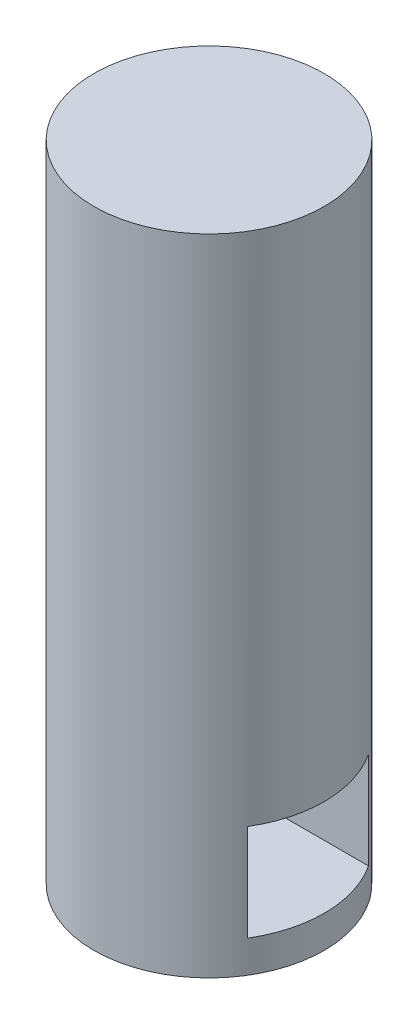
ISO-10303-21;
HEADER;
FILE_DESCRIPTION(('STEP AP214'),'2;1');
FILE_NAME('part.step','',(''),(''),'','','');
FILE_SCHEMA(('AUTOMOTIVE_DESIGN { 1 0 10303 214 1 1 1 1 }'));
ENDSEC;
DATA;
#1=APPLICATION_CONTEXT('core data for automotive mechanical design processes');
#2=APPLICATION_PROTOCOL_DEFINITION('international standard','automotive_design',2000,#1);
#3=PRODUCT_CONTEXT('',#1,'mechanical');
#4=PRODUCT('Part','Part','',(#3));
#5=PRODUCT_RELATED_PRODUCT_CATEGORY('part','',(#4));
#6=PRODUCT_DEFINITION_FORMATION('','',#4);
#7=PRODUCT_DEFINITION_CONTEXT('part definition',#1,'design');
#8=PRODUCT_DEFINITION('design','',#6,#7);
#9=PRODUCT_DEFINITION_SHAPE('','',#8);
#10=(LENGTH_UNIT() NAMED_UNIT(*) SI_UNIT(.MILLI.,.METRE.));
#11=(NAMED_UNIT(*) PLANE_ANGLE_UNIT() SI_UNIT($,.RADIAN.));
#12=(NAMED_UNIT(*) SI_UNIT($,.STERADIAN.) SOLID_ANGLE_UNIT());
#13=UNCERTAINTY_MEASURE_WITH_UNIT(LENGTH_MEASURE(1.E-05),#10,'distance_accuracy_value','');
#14=(GEOMETRIC_REPRESENTATION_CONTEXT(3) GLOBAL_UNCERTAINTY_ASSIGNED_CONTEXT((#13)) GLOBAL_UNIT_ASSIGNED_CONTEXT((#10,
#11,#12)) REPRESENTATION_CONTEXT('',''));
#15=CARTESIAN_POINT('',(0.,0.,0.));
#16=DIRECTION('',(0.,0.,1.));
#17=DIRECTION('',(1.,0.,0.));
#18=AXIS2_PLACEMENT_3D('',#15,#16,#17);
#19=CARTESIAN_POINT('',(0.,4.,0.));
#20=DIRECTION('',(0.,-1.,0.));
#21=DIRECTION('',(0.,0.,-1.));
#22=AXIS2_PLACEMENT_3D('',#19,#20,#21);
#23=CYLINDRICAL_SURFACE('',#22,1.);
#24=CARTESIAN_POINT('',(0.,0.,0.));
#25=DIRECTION('',(0.,-1.,0.));
#26=DIRECTION('',(0.,0.,-1.));
#27=AXIS2_PLACEMENT_3D('',#24,#25,#26);
#28=CIRCLE('',#27,1.);
#29=CARTESIAN_POINT('',(0.,0.,-1.));
#30=VERTEX_POINT('',#29);
#31=EDGE_CURVE('E92',#30,#30,#28,.T.);
#32=ORIENTED_EDGE('',*,*,#31,.T.);
#33=EDGE_LOOP('',(#32));
#34=FACE_BOUND('',#33,.T.);
#35=CARTESIAN_POINT('',(0.,2.,0.));
#36=DIRECTION('',(0.,1.,0.));
#37=DIRECTION('',(0.,0.,1.));
#38=AXIS2_PLACEMENT_3D('',#35,#36,#37);
#39=CIRCLE('',#38,1.);
#40=CARTESIAN_POINT('',(0.,2.,1.));
#41=VERTEX_POINT('',#40);
#42=EDGE_CURVE('E118',#41,#41,#39,.F.);
#43=ORIENTED_EDGE('',*,*,#42,.F.);
#44=EDGE_LOOP('',(#43));
#45=FACE_BOUND('',#44,.T.);
#46=ADVANCED_FACE('F45',(#34,#45),#23,.F.);
#47=CARTESIAN_POINT('',(0.,40.,0.));
#48=DIRECTION('',(0.,-1.,0.));
#49=DIRECTION('',(0.,0.,-1.));
#50=AXIS2_PLACEMENT_3D('',#47,#48,#49);
#51=CYLINDRICAL_SURFACE('',#50,7.15000000000021);
#52=DIRECTION('',(0.,-1.,0.));
#53=VECTOR('',#52,1.);
#54=CARTESIAN_POINT('',(6.10358410231384,40.,3.7240785579771));
#55=LINE('',#54,#53);
#56=CARTESIAN_POINT('',(6.10358410231384,8.,3.7240785579771));
#57=VERTEX_POINT('',#56);
#58=CARTESIAN_POINT('',(6.10358410231384,2.,3.7240785579771));
#59=VERTEX_POINT('',#58);
#60=EDGE_CURVE('E49',#57,#59,#55,.T.);
#61=ORIENTED_EDGE('',*,*,#60,.F.);
#62=CARTESIAN_POINT('',(0.,8.,0.));
#63=DIRECTION('',(0.,1.,0.));
#64=DIRECTION('',(0.,0.,1.));
#65=AXIS2_PLACEMENT_3D('',#62,#63,#64);
#66=CIRCLE('',#65,7.15000000000021);
#67=CARTESIAN_POINT('',(5.98060485445949,8.,-3.91852849610904));
#68=VERTEX_POINT('',#67);
#69=EDGE_CURVE('E11',#57,#68,#66,.T.);
#70=ORIENTED_EDGE('',*,*,#69,.T.);
#71=DIRECTION('',(0.,-1.,0.));
#72=VECTOR('',#71,1.);
#73=CARTESIAN_POINT('',(5.98060485445949,40.,-3.91852849610904));
#74=LINE('',#73,#72);
#75=CARTESIAN_POINT('',(5.98060485445949,2.,-3.91852849610904));
#76=VERTEX_POINT('',#75);
#77=EDGE_CURVE('E98',#76,#68,#74,.F.);
#78=ORIENTED_EDGE('',*,*,#77,.F.);
#79=CARTESIAN_POINT('',(0.,2.,0.));
#80=DIRECTION('',(0.,1.,0.));
#81=DIRECTION('',(0.,0.,1.));
#82=AXIS2_PLACEMENT_3D('',#79,#80,#81);
#83=CIRCLE('',#82,7.15000000000021);
#84=EDGE_CURVE('E86',#59,#76,#83,.T.);
#85=ORIENTED_EDGE('',*,*,#84,.F.);
#86=EDGE_LOOP('',(#61,#70,#78,#85));
#87=FACE_BOUND('',#86,.T.);
#88=DIRECTION('',(0.,-1.,0.));
#89=VECTOR('',#88,1.);
#90=CARTESIAN_POINT('',(-5.98060485445949,40.,-3.91852849610904));
#91=LINE('',#90,#89);
#92=CARTESIAN_POINT('',(-5.98060485445949,8.,-3.91852849610904));
#93=VERTEX_POINT('',#92);
#94=CARTESIAN_POINT('',(-5.98060485445949,2.,-3.91852849610904));
#95=VERTEX_POINT('',#94);
#96=EDGE_CURVE('E101',#93,#95,#91,.T.);
#97=ORIENTED_EDGE('',*,*,#96,.F.);
#98=CARTESIAN_POINT('',(-6.10358410231384,8.,3.7240785579771));
#99=VERTEX_POINT('',#98);
#100=EDGE_CURVE('E56',#93,#99,#66,.T.);
#101=ORIENTED_EDGE('',*,*,#100,.T.);
#102=DIRECTION('',(0.,-1.,0.));
#103=VECTOR('',#102,1.);
#104=CARTESIAN_POINT('',(-6.10358410231384,40.,3.7240785579771));
#105=LINE('',#104,#103);
#106=CARTESIAN_POINT('',(-6.10358410231384,2.,3.7240785579771));
#107=VERTEX_POINT('',#106);
#108=EDGE_CURVE('E111',#107,#99,#105,.F.);
#109=ORIENTED_EDGE('',*,*,#108,.F.);
#110=EDGE_CURVE('E93',#95,#107,#83,.T.);
#111=ORIENTED_EDGE('',*,*,#110,.F.);
#112=EDGE_LOOP('',(#97,#101,#109,#111));
#113=FACE_BOUND('',#112,.T.);
#114=CARTESIAN_POINT('',(0.,40.,0.));
#115=DIRECTION('',(0.,1.,0.));
#116=DIRECTION('',(0.,0.,1.));
#117=AXIS2_PLACEMENT_3D('',#114,#115,#116);
#118=CIRCLE('',#117,7.15000000000021);
#119=CARTESIAN_POINT('',(0.,40.,7.15000000000021));
#120=VERTEX_POINT('',#119);
#121=EDGE_CURVE('E117',#120,#120,#118,.T.);
#122=ORIENTED_EDGE('',*,*,#121,.F.);
#123=EDGE_LOOP('',(#122));
#124=FACE_BOUND('',#123,.T.);
#125=CARTESIAN_POINT('',(0.,0.,0.));
#126=DIRECTION('',(0.,1.,0.));
#127=DIRECTION('',(0.,0.,1.));
#128=AXIS2_PLACEMENT_3D('',#125,#126,#127);
#129=CIRCLE('',#128,7.15000000000021);
#130=CARTESIAN_POINT('',(0.,0.,7.15000000000021));
#131=VERTEX_POINT('',#130);
#132=EDGE_CURVE('E123',#131,#131,#129,.T.);
#133=ORIENTED_EDGE('',*,*,#132,.T.);
#134=EDGE_LOOP('',(#133));
#135=FACE_BOUND('',#134,.T.);
#136=ADVANCED_FACE('F47',(#87,#113,#124,#135),#51,.T.);
#137=CARTESIAN_POINT('',(0.,40.,0.));
#138=DIRECTION('',(0.,1.,0.));
#139=DIRECTION('',(0.,0.,1.));
#140=AXIS2_PLACEMENT_3D('',#137,#138,#139);
#141=PLANE('',#140);
#142=ORIENTED_EDGE('',*,*,#121,.T.);
#143=EDGE_LOOP('',(#142));
#144=FACE_BOUND('',#143,.T.);
#145=ADVANCED_FACE('F148',(#144),#141,.T.);
#146=CARTESIAN_POINT('',(0.,0.,0.));
#147=DIRECTION('',(0.,1.,0.));
#148=DIRECTION('',(0.,0.,1.));
#149=AXIS2_PLACEMENT_3D('',#146,#147,#148);
#150=PLANE('',#149);
#151=ORIENTED_EDGE('',*,*,#31,.F.);
#152=EDGE_LOOP('',(#151));
#153=FACE_BOUND('',#152,.T.);
#154=ORIENTED_EDGE('',*,*,#132,.F.);
#155=EDGE_LOOP('',(#154));
#156=FACE_BOUND('',#155,.T.);
#157=ADVANCED_FACE('F153',(#153,#156),#150,.F.);
#158=CARTESIAN_POINT('',(-7.54773140894798,8.,3.7240785579771));
#159=DIRECTION('',(0.,0.,-1.));
#160=DIRECTION('',(-1.,0.,0.));
#161=AXIS2_PLACEMENT_3D('',#158,#159,#160);
#162=PLANE('',#161);
#163=ORIENTED_EDGE('',*,*,#60,.T.);
#164=DIRECTION('',(1.,0.,0.));
#165=VECTOR('',#164,1.);
#166=CARTESIAN_POINT('',(-7.54773140894798,2.,3.7240785579771));
#167=LINE('',#166,#165);
#168=EDGE_CURVE('E63',#107,#59,#167,.T.);
#169=ORIENTED_EDGE('',*,*,#168,.F.);
#170=ORIENTED_EDGE('',*,*,#108,.T.);
#171=DIRECTION('',(1.,0.,0.));
#172=VECTOR('',#171,1.);
#173=CARTESIAN_POINT('',(-7.54773140894798,8.,3.7240785579771));
#174=LINE('',#173,#172);
#175=EDGE_CURVE('E104',#99,#57,#174,.T.);
#176=ORIENTED_EDGE('',*,*,#175,.T.);
#177=EDGE_LOOP('',(#163,#169,#170,#176));
#178=FACE_BOUND('',#177,.T.);
#179=ADVANCED_FACE('F142',(#178),#162,.T.);
#180=CARTESIAN_POINT('',(-7.54773140894798,8.,-3.91852849610904));
#181=DIRECTION('',(0.,0.,1.));
#182=DIRECTION('',(1.,0.,0.));
#183=AXIS2_PLACEMENT_3D('',#180,#181,#182);
#184=PLANE('',#183);
#185=ORIENTED_EDGE('',*,*,#96,.T.);
#186=DIRECTION('',(-1.,0.,0.));
#187=VECTOR('',#186,1.);
#188=CARTESIAN_POINT('',(-7.54773140894798,2.,-3.91852849610904));
#189=LINE('',#188,#187);
#190=EDGE_CURVE('E68',#76,#95,#189,.T.);
#191=ORIENTED_EDGE('',*,*,#190,.F.);
#192=ORIENTED_EDGE('',*,*,#77,.T.);
#193=DIRECTION('',(-1.,0.,0.));
#194=VECTOR('',#193,1.);
#195=CARTESIAN_POINT('',(-7.54773140894798,8.,-3.91852849610904));
#196=LINE('',#195,#194);
#197=EDGE_CURVE('E122',#68,#93,#196,.T.);
#198=ORIENTED_EDGE('',*,*,#197,.T.);
#199=EDGE_LOOP('',(#185,#191,#192,#198));
#200=FACE_BOUND('',#199,.T.);
#201=ADVANCED_FACE('F96',(#200),#184,.T.);
#202=CARTESIAN_POINT('',(0.,8.,0.));
#203=DIRECTION('',(0.,1.,0.));
#204=DIRECTION('',(0.,0.,1.));
#205=AXIS2_PLACEMENT_3D('',#202,#203,#204);
#206=PLANE('',#205);
#207=ORIENTED_EDGE('',*,*,#175,.F.);
#208=ORIENTED_EDGE('',*,*,#100,.F.);
#209=ORIENTED_EDGE('',*,*,#197,.F.);
#210=ORIENTED_EDGE('',*,*,#69,.F.);
#211=EDGE_LOOP('',(#207,#208,#209,#210));
#212=FACE_BOUND('',#211,.T.);
#213=ADVANCED_FACE('F145',(#212),#206,.F.);
#214=CARTESIAN_POINT('',(0.,2.,0.));
#215=DIRECTION('',(0.,1.,0.));
#216=DIRECTION('',(0.,0.,1.));
#217=AXIS2_PLACEMENT_3D('',#214,#215,#216);
#218=PLANE('',#217);
#219=ORIENTED_EDGE('',*,*,#42,.T.);
#220=EDGE_LOOP('',(#219));
#221=FACE_BOUND('',#220,.T.);
#222=ORIENTED_EDGE('',*,*,#84,.T.);
#223=ORIENTED_EDGE('',*,*,#190,.T.);
#224=ORIENTED_EDGE('',*,*,#110,.T.);
#225=ORIENTED_EDGE('',*,*,#168,.T.);
#226=EDGE_LOOP('',(#222,#223,#224,#225));
#227=FACE_BOUND('',#226,.T.);
#228=ADVANCED_FACE('F87',(#221,#227),#218,.T.);
#229=CLOSED_SHELL('',(#46,#136,#145,#157,#179,#201,#213,#228));
#230=MANIFOLD_SOLID_BREP('B2',#229);
#231=ADVANCED_BREP_SHAPE_REPRESENTATION('',(#18,#230),#14);
#232=SHAPE_DEFINITION_REPRESENTATION(#9,#231);
ENDSEC;
END-ISO-10303-21;
